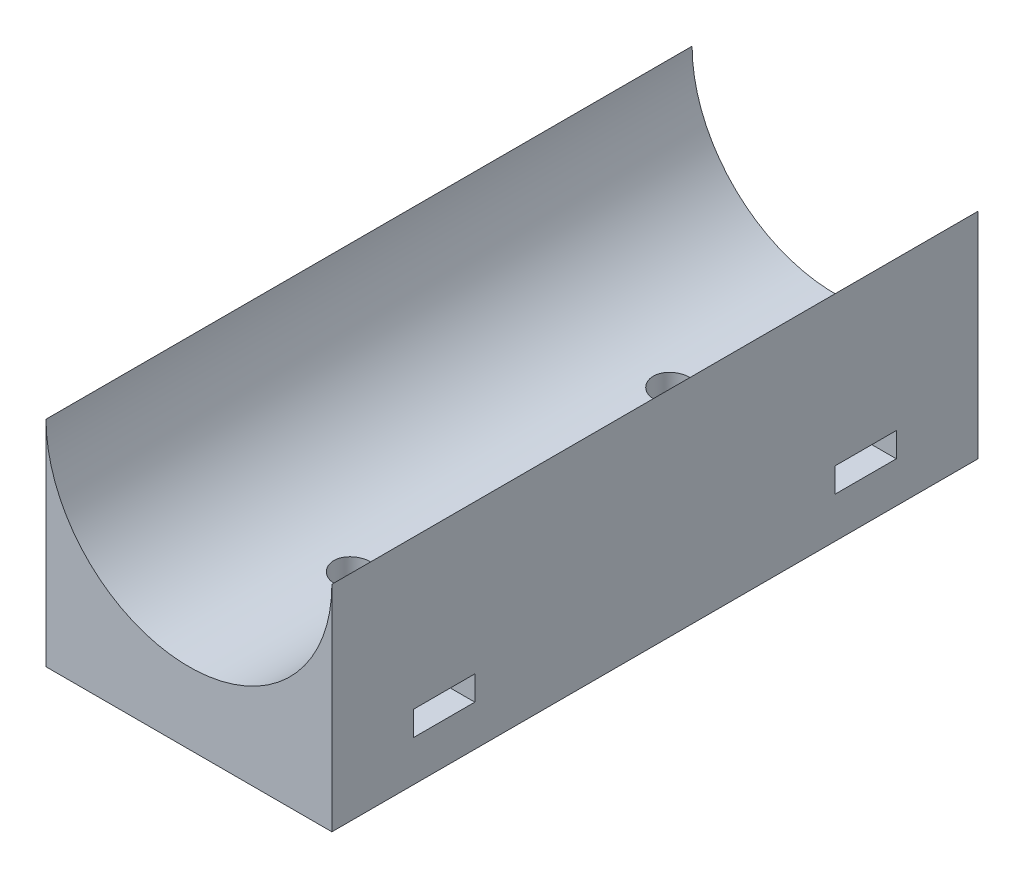
ISO-10303-21;
HEADER;
FILE_DESCRIPTION(('STEP AP214'),'2;1');
FILE_NAME('part.step','',(''),(''),'','','');
FILE_SCHEMA(('AUTOMOTIVE_DESIGN { 1 0 10303 214 1 1 1 1 }'));
ENDSEC;
DATA;
#1=APPLICATION_CONTEXT('core data for automotive mechanical design processes');
#2=APPLICATION_PROTOCOL_DEFINITION('international standard','automotive_design',2000,#1);
#3=PRODUCT_CONTEXT('',#1,'mechanical');
#4=PRODUCT('Part','Part','',(#3));
#5=PRODUCT_RELATED_PRODUCT_CATEGORY('part','',(#4));
#6=PRODUCT_DEFINITION_FORMATION('','',#4);
#7=PRODUCT_DEFINITION_CONTEXT('part definition',#1,'design');
#8=PRODUCT_DEFINITION('design','',#6,#7);
#9=PRODUCT_DEFINITION_SHAPE('','',#8);
#10=(LENGTH_UNIT() NAMED_UNIT(*) SI_UNIT(.MILLI.,.METRE.));
#11=(NAMED_UNIT(*) PLANE_ANGLE_UNIT() SI_UNIT($,.RADIAN.));
#12=(NAMED_UNIT(*) SI_UNIT($,.STERADIAN.) SOLID_ANGLE_UNIT());
#13=UNCERTAINTY_MEASURE_WITH_UNIT(LENGTH_MEASURE(1.E-05),#10,'distance_accuracy_value','');
#14=(GEOMETRIC_REPRESENTATION_CONTEXT(3) GLOBAL_UNCERTAINTY_ASSIGNED_CONTEXT((#13)) GLOBAL_UNIT_ASSIGNED_CONTEXT((#10,
#11,#12)) REPRESENTATION_CONTEXT('',''));
#15=CARTESIAN_POINT('',(0.,0.,0.));
#16=DIRECTION('',(0.,0.,1.));
#17=DIRECTION('',(1.,0.,0.));
#18=AXIS2_PLACEMENT_3D('',#15,#16,#17);
#19=CARTESIAN_POINT('',(0.,26.25,1687.65314094708));
#20=DIRECTION('',(1.,0.,0.));
#21=DIRECTION('',(0.,0.,-1.));
#22=AXIS2_PLACEMENT_3D('',#19,#20,#21);
#23=PLANE('',#22);
#24=DIRECTION('',(0.,0.,-1.));
#25=VECTOR('',#24,1.);
#26=CARTESIAN_POINT('',(0.,8.,1626.05314094708));
#27=LINE('',#26,#25);
#28=CARTESIAN_POINT('',(0.,8.,1626.05314094708));
#29=VERTEX_POINT('',#28);
#30=CARTESIAN_POINT('',(0.,8.,1618.55314094708));
#31=VERTEX_POINT('',#30);
#32=EDGE_CURVE('E239',#29,#31,#27,.T.);
#33=ORIENTED_EDGE('',*,*,#32,.F.);
#34=DIRECTION('',(0.,1.,0.));
#35=VECTOR('',#34,1.);
#36=CARTESIAN_POINT('',(0.,8.,1626.05314094708));
#37=LINE('',#36,#35);
#38=CARTESIAN_POINT('',(0.,5.,1626.05314094708));
#39=VERTEX_POINT('',#38);
#40=EDGE_CURVE('E152',#39,#29,#37,.T.);
#41=ORIENTED_EDGE('',*,*,#40,.F.);
#42=DIRECTION('',(0.,0.,1.));
#43=VECTOR('',#42,1.);
#44=CARTESIAN_POINT('',(0.,5.,1626.05314094708));
#45=LINE('',#44,#43);
#46=CARTESIAN_POINT('',(0.,5.,1618.55314094708));
#47=VERTEX_POINT('',#46);
#48=EDGE_CURVE('E149',#47,#39,#45,.T.);
#49=ORIENTED_EDGE('',*,*,#48,.F.);
#50=DIRECTION('',(0.,-1.,0.));
#51=VECTOR('',#50,1.);
#52=CARTESIAN_POINT('',(0.,8.,1618.55314094708));
#53=LINE('',#52,#51);
#54=EDGE_CURVE('E127',#31,#47,#53,.T.);
#55=ORIENTED_EDGE('',*,*,#54,.F.);
#56=EDGE_LOOP('',(#33,#41,#49,#55));
#57=FACE_BOUND('',#56,.T.);
#58=DIRECTION('',(0.,0.,-1.));
#59=VECTOR('',#58,1.);
#60=CARTESIAN_POINT('',(0.,8.,1677.65314094708));
#61=LINE('',#60,#59);
#62=CARTESIAN_POINT('',(0.,8.,1677.65314094708));
#63=VERTEX_POINT('',#62);
#64=CARTESIAN_POINT('',(0.,8.,1670.15314094708));
#65=VERTEX_POINT('',#64);
#66=EDGE_CURVE('E156',#63,#65,#61,.T.);
#67=ORIENTED_EDGE('',*,*,#66,.F.);
#68=DIRECTION('',(0.,1.,0.));
#69=VECTOR('',#68,1.);
#70=CARTESIAN_POINT('',(0.,8.,1677.65314094708));
#71=LINE('',#70,#69);
#72=CARTESIAN_POINT('',(0.,5.,1677.65314094708));
#73=VERTEX_POINT('',#72);
#74=EDGE_CURVE('E159',#73,#63,#71,.T.);
#75=ORIENTED_EDGE('',*,*,#74,.F.);
#76=DIRECTION('',(0.,0.,1.));
#77=VECTOR('',#76,1.);
#78=CARTESIAN_POINT('',(0.,5.,1677.65314094708));
#79=LINE('',#78,#77);
#80=CARTESIAN_POINT('',(0.,5.,1670.15314094708));
#81=VERTEX_POINT('',#80);
#82=EDGE_CURVE('E161',#81,#73,#79,.T.);
#83=ORIENTED_EDGE('',*,*,#82,.F.);
#84=DIRECTION('',(0.,-1.,0.));
#85=VECTOR('',#84,1.);
#86=CARTESIAN_POINT('',(0.,8.,1670.15314094708));
#87=LINE('',#86,#85);
#88=EDGE_CURVE('E153',#65,#81,#87,.T.);
#89=ORIENTED_EDGE('',*,*,#88,.F.);
#90=EDGE_LOOP('',(#67,#75,#83,#89));
#91=FACE_BOUND('',#90,.T.);
#92=DIRECTION('',(0.,-1.,0.));
#93=VECTOR('',#92,1.);
#94=CARTESIAN_POINT('',(0.,26.25,1608.55314094708));
#95=LINE('',#94,#93);
#96=CARTESIAN_POINT('',(0.,26.25,1608.55314094708));
#97=VERTEX_POINT('',#96);
#98=CARTESIAN_POINT('',(0.,0.,1608.55314094708));
#99=VERTEX_POINT('',#98);
#100=EDGE_CURVE('E248',#97,#99,#95,.T.);
#101=ORIENTED_EDGE('',*,*,#100,.T.);
#102=DIRECTION('',(0.,0.,-1.));
#103=VECTOR('',#102,1.);
#104=CARTESIAN_POINT('',(0.,0.,1687.65314094708));
#105=LINE('',#104,#103);
#106=CARTESIAN_POINT('',(0.,0.,1687.65314094708));
#107=VERTEX_POINT('',#106);
#108=EDGE_CURVE('E11',#107,#99,#105,.T.);
#109=ORIENTED_EDGE('',*,*,#108,.F.);
#110=DIRECTION('',(0.,-1.,0.));
#111=VECTOR('',#110,1.);
#112=CARTESIAN_POINT('',(0.,26.25,1687.65314094708));
#113=LINE('',#112,#111);
#114=CARTESIAN_POINT('',(0.,26.25,1687.65314094708));
#115=VERTEX_POINT('',#114);
#116=EDGE_CURVE('E267',#115,#107,#113,.T.);
#117=ORIENTED_EDGE('',*,*,#116,.F.);
#118=DIRECTION('',(0.,0.,-1.));
#119=VECTOR('',#118,1.);
#120=CARTESIAN_POINT('',(0.,26.25,1687.65314094708));
#121=LINE('',#120,#119);
#122=EDGE_CURVE('E251',#115,#97,#121,.T.);
#123=ORIENTED_EDGE('',*,*,#122,.T.);
#124=EDGE_LOOP('',(#101,#109,#117,#123));
#125=FACE_BOUND('',#124,.T.);
#126=ADVANCED_FACE('F33',(#57,#91,#125),#23,.F.);
#127=CARTESIAN_POINT('',(0.,0.,1687.65314094708));
#128=DIRECTION('',(0.,1.,0.));
#129=DIRECTION('',(0.,0.,1.));
#130=AXIS2_PLACEMENT_3D('',#127,#128,#129);
#131=PLANE('',#130);
#132=CARTESIAN_POINT('',(17.4999999967561,0.,1628.55314094708));
#133=DIRECTION('',(0.,1.,0.));
#134=DIRECTION('',(0.,0.,1.));
#135=AXIS2_PLACEMENT_3D('',#132,#133,#134);
#136=CIRCLE('',#135,2.25000000000009);
#137=CARTESIAN_POINT('',(17.4999999967561,0.,1630.80314094708));
#138=VERTEX_POINT('',#137);
#139=EDGE_CURVE('E181',#138,#138,#136,.T.);
#140=ORIENTED_EDGE('',*,*,#139,.T.);
#141=EDGE_LOOP('',(#140));
#142=FACE_BOUND('',#141,.T.);
#143=CARTESIAN_POINT('',(17.5,0.,1667.65314094708));
#144=DIRECTION('',(0.,1.,0.));
#145=DIRECTION('',(0.,0.,1.));
#146=AXIS2_PLACEMENT_3D('',#143,#144,#145);
#147=CIRCLE('',#146,2.24999999999999);
#148=CARTESIAN_POINT('',(17.5,0.,1669.90314094708));
#149=VERTEX_POINT('',#148);
#150=EDGE_CURVE('E191',#149,#149,#147,.T.);
#151=ORIENTED_EDGE('',*,*,#150,.T.);
#152=EDGE_LOOP('',(#151));
#153=FACE_BOUND('',#152,.T.);
#154=DIRECTION('',(1.,0.,0.));
#155=VECTOR('',#154,1.);
#156=CARTESIAN_POINT('',(0.,0.,1608.55314094708));
#157=LINE('',#156,#155);
#158=CARTESIAN_POINT('',(35.,0.,1608.55314094708));
#159=VERTEX_POINT('',#158);
#160=EDGE_CURVE('E254',#99,#159,#157,.T.);
#161=ORIENTED_EDGE('',*,*,#160,.T.);
#162=DIRECTION('',(0.,0.,-1.));
#163=VECTOR('',#162,1.);
#164=CARTESIAN_POINT('',(35.,0.,1687.65314094708));
#165=LINE('',#164,#163);
#166=CARTESIAN_POINT('',(35.,0.,1687.65314094708));
#167=VERTEX_POINT('',#166);
#168=EDGE_CURVE('E40',#167,#159,#165,.T.);
#169=ORIENTED_EDGE('',*,*,#168,.F.);
#170=DIRECTION('',(1.,0.,0.));
#171=VECTOR('',#170,1.);
#172=CARTESIAN_POINT('',(0.,0.,1687.65314094708));
#173=LINE('',#172,#171);
#174=EDGE_CURVE('E285',#107,#167,#173,.T.);
#175=ORIENTED_EDGE('',*,*,#174,.F.);
#176=ORIENTED_EDGE('',*,*,#108,.T.);
#177=EDGE_LOOP('',(#161,#169,#175,#176));
#178=FACE_BOUND('',#177,.T.);
#179=ADVANCED_FACE('F230',(#142,#153,#178),#131,.F.);
#180=CARTESIAN_POINT('',(35.,26.25,1687.65314094708));
#181=DIRECTION('',(-1.,0.,0.));
#182=DIRECTION('',(0.,0.,1.));
#183=AXIS2_PLACEMENT_3D('',#180,#181,#182);
#184=PLANE('',#183);
#185=DIRECTION('',(0.,0.,-1.));
#186=VECTOR('',#185,1.);
#187=CARTESIAN_POINT('',(35.,5.,1626.05314094708));
#188=LINE('',#187,#186);
#189=CARTESIAN_POINT('',(35.,5.,1626.05314094708));
#190=VERTEX_POINT('',#189);
#191=CARTESIAN_POINT('',(35.,5.,1618.55314094708));
#192=VERTEX_POINT('',#191);
#193=EDGE_CURVE('E133',#190,#192,#188,.T.);
#194=ORIENTED_EDGE('',*,*,#193,.F.);
#195=DIRECTION('',(0.,-1.,0.));
#196=VECTOR('',#195,1.);
#197=CARTESIAN_POINT('',(35.,8.,1626.05314094708));
#198=LINE('',#197,#196);
#199=CARTESIAN_POINT('',(35.,8.,1626.05314094708));
#200=VERTEX_POINT('',#199);
#201=EDGE_CURVE('E55',#200,#190,#198,.T.);
#202=ORIENTED_EDGE('',*,*,#201,.F.);
#203=DIRECTION('',(0.,0.,1.));
#204=VECTOR('',#203,1.);
#205=CARTESIAN_POINT('',(35.,8.,1626.05314094708));
#206=LINE('',#205,#204);
#207=CARTESIAN_POINT('',(35.,8.,1618.55314094708));
#208=VERTEX_POINT('',#207);
#209=EDGE_CURVE('E140',#208,#200,#206,.T.);
#210=ORIENTED_EDGE('',*,*,#209,.F.);
#211=DIRECTION('',(0.,1.,0.));
#212=VECTOR('',#211,1.);
#213=CARTESIAN_POINT('',(35.,8.,1618.55314094708));
#214=LINE('',#213,#212);
#215=EDGE_CURVE('E124',#192,#208,#214,.T.);
#216=ORIENTED_EDGE('',*,*,#215,.F.);
#217=EDGE_LOOP('',(#194,#202,#210,#216));
#218=FACE_BOUND('',#217,.T.);
#219=DIRECTION('',(0.,0.,-1.));
#220=VECTOR('',#219,1.);
#221=CARTESIAN_POINT('',(35.,5.,1677.65314094708));
#222=LINE('',#221,#220);
#223=CARTESIAN_POINT('',(35.,5.,1677.65314094708));
#224=VERTEX_POINT('',#223);
#225=CARTESIAN_POINT('',(35.,5.,1670.15314094708));
#226=VERTEX_POINT('',#225);
#227=EDGE_CURVE('E163',#224,#226,#222,.T.);
#228=ORIENTED_EDGE('',*,*,#227,.F.);
#229=DIRECTION('',(0.,-1.,0.));
#230=VECTOR('',#229,1.);
#231=CARTESIAN_POINT('',(35.,8.,1677.65314094708));
#232=LINE('',#231,#230);
#233=CARTESIAN_POINT('',(35.,8.,1677.65314094708));
#234=VERTEX_POINT('',#233);
#235=EDGE_CURVE('E151',#234,#224,#232,.T.);
#236=ORIENTED_EDGE('',*,*,#235,.F.);
#237=DIRECTION('',(0.,0.,1.));
#238=VECTOR('',#237,1.);
#239=CARTESIAN_POINT('',(35.,8.,1677.65314094708));
#240=LINE('',#239,#238);
#241=CARTESIAN_POINT('',(35.,8.,1670.15314094708));
#242=VERTEX_POINT('',#241);
#243=EDGE_CURVE('E169',#242,#234,#240,.T.);
#244=ORIENTED_EDGE('',*,*,#243,.F.);
#245=DIRECTION('',(0.,1.,0.));
#246=VECTOR('',#245,1.);
#247=CARTESIAN_POINT('',(35.,8.,1670.15314094708));
#248=LINE('',#247,#246);
#249=EDGE_CURVE('E166',#226,#242,#248,.T.);
#250=ORIENTED_EDGE('',*,*,#249,.F.);
#251=EDGE_LOOP('',(#228,#236,#244,#250));
#252=FACE_BOUND('',#251,.T.);
#253=DIRECTION('',(0.,1.,0.));
#254=VECTOR('',#253,1.);
#255=CARTESIAN_POINT('',(35.,26.25,1608.55314094708));
#256=LINE('',#255,#254);
#257=CARTESIAN_POINT('',(35.,26.25,1608.55314094708));
#258=VERTEX_POINT('',#257);
#259=EDGE_CURVE('E257',#159,#258,#256,.T.);
#260=ORIENTED_EDGE('',*,*,#259,.T.);
#261=DIRECTION('',(0.,0.,-1.));
#262=VECTOR('',#261,1.);
#263=CARTESIAN_POINT('',(35.,26.25,1687.65314094708));
#264=LINE('',#263,#262);
#265=CARTESIAN_POINT('',(35.,26.25,1687.65314094708));
#266=VERTEX_POINT('',#265);
#267=EDGE_CURVE('E269',#266,#258,#264,.T.);
#268=ORIENTED_EDGE('',*,*,#267,.F.);
#269=DIRECTION('',(0.,1.,0.));
#270=VECTOR('',#269,1.);
#271=CARTESIAN_POINT('',(35.,26.25,1687.65314094708));
#272=LINE('',#271,#270);
#273=EDGE_CURVE('E277',#167,#266,#272,.T.);
#274=ORIENTED_EDGE('',*,*,#273,.F.);
#275=ORIENTED_EDGE('',*,*,#168,.T.);
#276=EDGE_LOOP('',(#260,#268,#274,#275));
#277=FACE_BOUND('',#276,.T.);
#278=ADVANCED_FACE('F137',(#218,#252,#277),#184,.F.);
#279=CARTESIAN_POINT('',(17.5,26.25,1687.65314094708));
#280=DIRECTION('',(0.,0.,-1.));
#281=DIRECTION('',(-1.,0.,0.));
#282=AXIS2_PLACEMENT_3D('',#279,#280,#281);
#283=CYLINDRICAL_SURFACE('',#282,17.5);
#284=CARTESIAN_POINT('',(17.4999999978374,8.75,1626.30314094708));
#285=CARTESIAN_POINT('',(17.6258266617738,8.75000179600986,1626.30314627395));
#286=CARTESIAN_POINT('',(17.7517312142782,8.75137137614066,1626.31373144051));
#287=CARTESIAN_POINT('',(18.0000347508825,8.75670315495112,1626.35578947551));
#288=CARTESIAN_POINT('',(18.1224299702854,8.76066803659769,1626.38728396003));
#289=CARTESIAN_POINT('',(18.3600843557582,8.77074389818164,1626.47021560561));
#290=CARTESIAN_POINT('',(18.4753483411962,8.77685340970022,1626.52163912385));
#291=CARTESIAN_POINT('',(18.69558917955,8.79053961235518,1626.64293879086));
#292=CARTESIAN_POINT('',(18.8005677484096,8.79811605812911,1626.71281185443));
#293=CARTESIAN_POINT('',(18.9978891192236,8.8139398982389,1626.86946102291));
#294=CARTESIAN_POINT('',(19.090163533246,8.82219056988019,1626.95632294961));
#295=CARTESIAN_POINT('',(19.2588681393375,8.83840663855668,1627.14429981096));
#296=CARTESIAN_POINT('',(19.3352975108857,8.84637202080078,1627.24541548328));
#297=CARTESIAN_POINT('',(19.4703988189745,8.86114782000338,1627.4594760623));
#298=CARTESIAN_POINT('',(19.5290063920937,8.8679540125294,1627.5724619078));
#299=CARTESIAN_POINT('',(19.6263893739097,8.879597353629,1627.80677453463));
#300=CARTESIAN_POINT('',(19.6651655774482,8.88443458111715,1627.92810098144));
#301=CARTESIAN_POINT('',(19.7215766511488,8.89156086077708,1628.17493962781));
#302=CARTESIAN_POINT('',(19.7393272305207,8.89386385443797,1628.30042497429));
#303=CARTESIAN_POINT('',(19.7535412807915,8.8957035268884,1628.55261296313));
#304=CARTESIAN_POINT('',(19.75000565572,8.89524032315895,1628.67931555357));
#305=CARTESIAN_POINT('',(19.7218425871825,8.89161269513579,1628.92953357084));
#306=CARTESIAN_POINT('',(19.6973427872308,8.88846461847485,1629.05306363522));
#307=CARTESIAN_POINT('',(19.6281460700384,8.87984745579833,1629.29424449096));
#308=CARTESIAN_POINT('',(19.5834487219485,8.87437832027065,1629.41189515684));
#309=CARTESIAN_POINT('',(19.4749890941291,8.86171680081241,1629.63837300161));
#310=CARTESIAN_POINT('',(19.4111715317994,8.85451943215859,1629.74717341576));
#311=CARTESIAN_POINT('',(19.2663225454983,8.83921622760884,1629.95256896199));
#312=CARTESIAN_POINT('',(19.1852902887966,8.83111034777425,1630.04916350327));
#313=CARTESIAN_POINT('',(19.0076056072231,8.81483083628081,1630.22814607941));
#314=CARTESIAN_POINT('',(18.9108431963408,8.80665714296976,1630.31042495957));
#315=CARTESIAN_POINT('',(18.7048231228902,8.79121842723455,1630.4575900876));
#316=CARTESIAN_POINT('',(18.5955654285917,8.78395340711794,1630.52247629131));
#317=CARTESIAN_POINT('',(18.3675706586007,8.77114572460755,1630.63301499328));
#318=CARTESIAN_POINT('',(18.2488301301963,8.76560369318281,1630.67866044764));
#319=CARTESIAN_POINT('',(18.0052826254796,8.75687207768555,1630.74933420714));
#320=CARTESIAN_POINT('',(17.8804759500655,8.75368237705742,1630.7743635338));
#321=CARTESIAN_POINT('',(17.6292825295654,8.75003000383695,1630.80295258997));
#322=CARTESIAN_POINT('',(17.5029131602783,8.74954823765919,1630.80666264534));
#323=CARTESIAN_POINT('',(17.2513544216895,8.75131440756062,1630.79290485969));
#324=CARTESIAN_POINT('',(17.1261650258315,8.75356228205827,1630.77543749645));
#325=CARTESIAN_POINT('',(16.8809650206226,8.76052327557305,1630.71994560954));
#326=CARTESIAN_POINT('',(16.7609378774166,8.76522777231829,1630.68199296967));
#327=CARTESIAN_POINT('',(16.5289516807731,8.77657544522559,1630.58668274195));
#328=CARTESIAN_POINT('',(16.4169929158314,8.78321869066739,1630.52932446064));
#329=CARTESIAN_POINT('',(16.2036515701694,8.79775114171666,1630.39646889763));
#330=CARTESIAN_POINT('',(16.1023298463052,8.80564692966052,1630.32087462364));
#331=CARTESIAN_POINT('',(15.9137583963126,8.82178117445856,1630.15382984644));
#332=CARTESIAN_POINT('',(15.8265092627168,8.83001964572321,1630.06237867592));
#333=CARTESIAN_POINT('',(15.6680245111409,8.84596985885961,1629.86555293616));
#334=CARTESIAN_POINT('',(15.5968886930534,8.85367812257582,1629.76009768455));
#335=CARTESIAN_POINT('',(15.4733398726244,8.86763736390481,1629.53864778007));
#336=CARTESIAN_POINT('',(15.4209264767642,8.87388837214607,1629.4226533488));
#337=CARTESIAN_POINT('',(15.3364709935068,8.88420143687275,1629.18373652056));
#338=CARTESIAN_POINT('',(15.3043731351808,8.88826948138774,1629.0608341078));
#339=CARTESIAN_POINT('',(15.2612805208833,8.89377302490021,1628.81132802519));
#340=CARTESIAN_POINT('',(15.2502847215265,8.89520865405654,1628.68472453865));
#341=CARTESIAN_POINT('',(15.2497282501389,8.89528088028547,1628.43240321227));
#342=CARTESIAN_POINT('',(15.2600107761963,8.89393795280608,1628.30668569539));
#343=CARTESIAN_POINT('',(15.3013865029429,8.8886484638993,1628.05878183304));
#344=CARTESIAN_POINT('',(15.3324797017695,8.88470190270494,1627.93659548726));
#345=CARTESIAN_POINT('',(15.4145442530073,8.87465626716688,1627.69924606574));
#346=CARTESIAN_POINT('',(15.4655075956655,8.8685580602562,1627.58408018163));
#347=CARTESIAN_POINT('',(15.585850357649,8.85489487121359,1627.36390932706));
#348=CARTESIAN_POINT('',(15.6552300604445,8.84732986650473,1627.25890451303));
#349=CARTESIAN_POINT('',(15.811016352984,8.83151872158675,1627.06123553117));
#350=CARTESIAN_POINT('',(15.897539732207,8.82326814827556,1626.96866375466));
#351=CARTESIAN_POINT('',(16.0849129178364,8.80705436566009,1626.79929400653));
#352=CARTESIAN_POINT('',(16.1857660899385,8.79909122441871,1626.72249975101));
#353=CARTESIAN_POINT('',(16.3994029264507,8.78431398982926,1626.58660007733));
#354=CARTESIAN_POINT('',(16.5122329074654,8.77750464279797,1626.52756698602));
#355=CARTESIAN_POINT('',(16.7462308864178,8.76585004092236,1626.42937138013));
#356=CARTESIAN_POINT('',(16.8673897184376,8.76100266615589,1626.39018740688));
#357=CARTESIAN_POINT('',(17.0743040698097,8.75497856708628,1626.34211758211));
#358=CARTESIAN_POINT('',(17.1587581371535,8.75312076424168,1626.32752252307));
#359=CARTESIAN_POINT('',(17.3287961201553,8.75063087452587,1626.30803243185));
#360=CARTESIAN_POINT('',(17.4143800268048,8.74999877788771,1626.30313732236));
#361=CARTESIAN_POINT('',(17.4999999978374,8.75,1626.30314094708));
#362=B_SPLINE_CURVE_WITH_KNOTS('',3,(#284,#285,#286,#287,#288,#289,#290,#291,#292,#293,#294,
#295,#296,#297,#298,#299,#300,#301,#302,#303,#304,#305,#306,#307,#308,#309,#310,#311,#312,#313,
#314,#315,#316,#317,#318,#319,#320,#321,#322,#323,#324,#325,#326,#327,#328,#329,#330,#331,#332,
#333,#334,#335,#336,#337,#338,#339,#340,#341,#342,#343,#344,#345,#346,#347,#348,#349,#350,#351,
#352,#353,#354,#355,#356,#357,#358,#359,#360,#361),.UNSPECIFIED.,.T.,.F.,(4,2,2,2,2,2,2,2,2,2,2,
2,2,2,2,2,2,2,2,2,2,2,2,2,2,2,2,2,2,2,2,2,2,2,2,2,2,2,4),(0.,0.377167233438984,
0.754724991353809,1.13202473972151,1.50926143458833,1.88845545438442,2.26766910549001,
2.64823645182459,3.02878854381839,3.40723648686324,3.78566835725645,4.16181235141852,
4.53796436977002,4.9152146341355,5.29248315147274,5.67251296808488,6.05254374975563,
6.43271353754754,6.81286448704381,7.19033160575384,7.56779020884587,7.94393282192979,
8.32008887783615,8.69829151453878,9.07651007147589,9.45701074759529,9.83750342565795,
10.2169469787708,10.5963717699233,10.9730105043803,11.3496492051294,11.7261362376714,
12.1026290655546,12.4817808194568,12.8610217739108,13.2417867945203,13.6221392909519,
13.8787884296895,14.135435523328),.UNSPECIFIED.);
#363=CARTESIAN_POINT('',(17.4999999978374,8.75,1626.30314094708));
#364=VERTEX_POINT('',#363);
#365=EDGE_CURVE('E184',#364,#364,#362,.T.);
#366=ORIENTED_EDGE('',*,*,#365,.T.);
#367=EDGE_LOOP('',(#366));
#368=FACE_BOUND('',#367,.T.);
#369=CARTESIAN_POINT('',(17.5,8.75,1669.90314094708));
#370=CARTESIAN_POINT('',(17.3741733360636,8.7500017960254,1669.90313562021));
#371=CARTESIAN_POINT('',(17.2482687835594,8.75137137617176,1669.89255045365));
#372=CARTESIAN_POINT('',(16.9999652469558,8.75670315501291,1669.85049241865));
#373=CARTESIAN_POINT('',(16.8775700275533,8.76066803667461,1669.81899793412));
#374=CARTESIAN_POINT('',(16.6399156420818,8.77074389828793,1669.73606628854));
#375=CARTESIAN_POINT('',(16.5246516566445,8.77685340982075,1669.6846427703));
#376=CARTESIAN_POINT('',(16.3044108182924,8.79053961250292,1669.56334310329));
#377=CARTESIAN_POINT('',(16.1994322494338,8.79811605828983,1669.49347003972));
#378=CARTESIAN_POINT('',(16.0021108786218,8.813939898424,1669.33682087125));
#379=CARTESIAN_POINT('',(15.9098364646004,8.82219057007669,1669.24995894455));
#380=CARTESIAN_POINT('',(15.741131858511,8.83840663877403,1669.06198208319));
#381=CARTESIAN_POINT('',(15.6647024869638,8.84637202102756,1668.96086641088));
#382=CARTESIAN_POINT('',(15.5296011788768,8.86114782024685,1668.74680583186));
#383=CARTESIAN_POINT('',(15.4709936057584,8.86795401278012,1668.63381998635));
#384=CARTESIAN_POINT('',(15.3736106239438,8.87959735389176,1668.39950735953));
#385=CARTESIAN_POINT('',(15.3348344204059,8.8844345813847,1668.27818091271));
#386=CARTESIAN_POINT('',(15.2784233467062,8.8915608610516,1668.03134226635));
#387=CARTESIAN_POINT('',(15.2606727673346,8.89386385471468,1667.90585691987));
#388=CARTESIAN_POINT('',(15.246458717064,8.89570352716687,1667.65366893103));
#389=CARTESIAN_POINT('',(15.2499943421354,8.89524032343698,1667.52696634059));
#390=CARTESIAN_POINT('',(15.2781574106725,8.89161269541034,1667.27674832332));
#391=CARTESIAN_POINT('',(15.3026572106238,8.88846461874638,1667.15321825894));
#392=CARTESIAN_POINT('',(15.3718539278152,8.87984745606131,1666.9120374032));
#393=CARTESIAN_POINT('',(15.4165512759044,8.8743783205281,1666.79438673731));
#394=CARTESIAN_POINT('',(15.5250109037223,8.86171680105646,1666.56790889254));
#395=CARTESIAN_POINT('',(15.5888284660511,8.85451943239475,1666.45910847839));
#396=CARTESIAN_POINT('',(15.7336774523502,8.83921622782711,1666.25371293217));
#397=CARTESIAN_POINT('',(15.814709709051,8.8311103479825,1666.15711839089));
#398=CARTESIAN_POINT('',(15.9923943906225,8.8148308364671,1665.97813581474));
#399=CARTESIAN_POINT('',(16.0891568015038,8.8066571431441,1665.89585693459));
#400=CARTESIAN_POINT('',(16.2951768749524,8.79121842738343,1665.74869180656));
#401=CARTESIAN_POINT('',(16.4044345692501,8.78395340725332,1665.68380560285));
#402=CARTESIAN_POINT('',(16.6324293392395,8.77114572471476,1665.57326690087));
#403=CARTESIAN_POINT('',(16.7511698676433,8.76560369327534,1665.52762144651));
#404=CARTESIAN_POINT('',(16.9947173723588,8.75687207774799,1665.45694768701));
#405=CARTESIAN_POINT('',(17.1195240477724,8.75368237710444,1665.43191836035));
#406=CARTESIAN_POINT('',(17.370717468272,8.75003000385293,1665.40332930419));
#407=CARTESIAN_POINT('',(17.497086837559,8.74954823765954,1665.39961924882));
#408=CARTESIAN_POINT('',(17.7486455761481,8.75131440752989,1665.41337703446));
#409=CARTESIAN_POINT('',(17.8738349720064,8.75356228201208,1665.43084439771));
#410=CARTESIAN_POINT('',(18.1190349772161,8.76052327549655,1665.48633628462));
#411=CARTESIAN_POINT('',(18.2390621204227,8.76522777222696,1665.52428892448));
#412=CARTESIAN_POINT('',(18.4710483170676,8.77657544510559,1665.6195991522));
#413=CARTESIAN_POINT('',(18.58300708201,8.78321869053355,1665.67695743352));
#414=CARTESIAN_POINT('',(18.7963484276738,8.79775114155647,1665.80981299652));
#415=CARTESIAN_POINT('',(18.8976701515391,8.80564692948781,1665.88540727052));
#416=CARTESIAN_POINT('',(19.0862416015337,8.82178117426254,1666.05245204771));
#417=CARTESIAN_POINT('',(19.1734907351305,8.8300196455164,1666.14390321823));
#418=CARTESIAN_POINT('',(19.3319754867083,8.84596985863321,1666.34072895799));
#419=CARTESIAN_POINT('',(19.4031113047967,8.85367812234063,1666.44618420961));
#420=CARTESIAN_POINT('',(19.5266601252274,8.86763736365434,1666.66763411408));
#421=CARTESIAN_POINT('',(19.5790735210885,8.87388837188913,1666.78362854536));
#422=CARTESIAN_POINT('',(19.6635290043471,8.88420143660537,1667.0225453736));
#423=CARTESIAN_POINT('',(19.6956268626736,8.8882694811164,1667.14544778635));
#424=CARTESIAN_POINT('',(19.7387194769718,8.89377302462354,1667.39495386896));
#425=CARTESIAN_POINT('',(19.7497152763287,8.89520865377852,1667.5215573555));
#426=CARTESIAN_POINT('',(19.7502717477164,8.89528088000738,1667.77387868188));
#427=CARTESIAN_POINT('',(19.7399892216588,8.89393795252925,1667.89959619876));
#428=CARTESIAN_POINT('',(19.6986134949116,8.88864846362759,1668.14750006111));
#429=CARTESIAN_POINT('',(19.6675202960845,8.88470190243708,1668.2696864069));
#430=CARTESIAN_POINT('',(19.5854557448455,8.87465626690916,1668.50703582841));
#431=CARTESIAN_POINT('',(19.5344924021865,8.86855806000478,1668.62220171252));
#432=CARTESIAN_POINT('',(19.4141496402014,8.85489487097704,1668.84237256709));
#433=CARTESIAN_POINT('',(19.3447699374049,8.84732986627676,1668.94737738112));
#434=CARTESIAN_POINT('',(19.1889836448634,8.83151872137802,1669.14504636299));
#435=CARTESIAN_POINT('',(19.1024602656394,8.82326814807753,1669.23761813949));
#436=CARTESIAN_POINT('',(18.915087080008,8.80705436548521,1669.40698788763));
#437=CARTESIAN_POINT('',(18.8142339079049,8.79909122425629,1669.48378214314));
#438=CARTESIAN_POINT('',(18.6005970713908,8.78431398969324,1669.61968181682));
#439=CARTESIAN_POINT('',(18.4877670903753,8.77750464267591,1669.67871490813));
#440=CARTESIAN_POINT('',(18.2537691114215,8.76585004082921,1669.77691051402));
#441=CARTESIAN_POINT('',(18.1326102794011,8.76100266607771,1669.81609448728));
#442=CARTESIAN_POINT('',(17.9256959280283,8.75497856703367,1669.86416431205));
#443=CARTESIAN_POINT('',(17.8412418606843,8.75312076419951,1669.87875937108));
#444=CARTESIAN_POINT('',(17.6712038776822,8.75063087450472,1669.89824946231));
#445=CARTESIAN_POINT('',(17.5856199710326,8.74999877787713,1669.9031445718));
#446=CARTESIAN_POINT('',(17.5,8.75,1669.90314094708));
#447=B_SPLINE_CURVE_WITH_KNOTS('',3,(#369,#370,#371,#372,#373,#374,#375,#376,#377,#378,#379,
#380,#381,#382,#383,#384,#385,#386,#387,#388,#389,#390,#391,#392,#393,#394,#395,#396,#397,#398,
#399,#400,#401,#402,#403,#404,#405,#406,#407,#408,#409,#410,#411,#412,#413,#414,#415,#416,#417,
#418,#419,#420,#421,#422,#423,#424,#425,#426,#427,#428,#429,#430,#431,#432,#433,#434,#435,#436,
#437,#438,#439,#440,#441,#442,#443,#444,#445,#446),.UNSPECIFIED.,.T.,.F.,(4,2,2,2,2,2,2,2,2,2,2,
2,2,2,2,2,2,2,2,2,2,2,2,2,2,2,2,2,2,2,2,2,2,2,2,2,2,2,4),(0.,0.377167233438959,0.7547249913538,
1.13202473972162,1.50926143458827,1.88845545438431,2.2676691054899,2.64823645182448,
3.02878854381828,3.40723648686313,3.78566835725634,4.16181235141841,4.53796436976991,
4.91521463413539,5.29248315147265,5.67251296808481,6.05254374975557,6.43271353754746,
6.81286448704356,7.1903316057536,7.56779020884569,7.94393282192945,8.32008887783591,
8.69829151453846,9.07651007147551,9.45701074759491,9.83750342565757,10.2169469787704,
10.5963717699229,10.9730105043801,11.349649205129,11.7261362376705,12.1026290655542,
12.4817808194563,12.8610217739105,13.2417867945198,13.6221392909513,13.878788429689,
14.1354355233275),.UNSPECIFIED.);
#448=CARTESIAN_POINT('',(17.5,8.75,1669.90314094708));
#449=VERTEX_POINT('',#448);
#450=EDGE_CURVE('E255',#449,#449,#447,.T.);
#451=ORIENTED_EDGE('',*,*,#450,.T.);
#452=EDGE_LOOP('',(#451));
#453=FACE_BOUND('',#452,.T.);
#454=CARTESIAN_POINT('',(17.5,26.25,1608.55314094708));
#455=DIRECTION('',(0.,0.,-1.));
#456=DIRECTION('',(1.,0.,0.));
#457=AXIS2_PLACEMENT_3D('',#454,#455,#456);
#458=CIRCLE('',#457,17.5);
#459=EDGE_CURVE('E265',#258,#97,#458,.T.);
#460=ORIENTED_EDGE('',*,*,#459,.T.);
#461=ORIENTED_EDGE('',*,*,#122,.F.);
#462=CARTESIAN_POINT('',(17.5,26.25,1687.65314094708));
#463=DIRECTION('',(0.,0.,-1.));
#464=DIRECTION('',(1.,0.,0.));
#465=AXIS2_PLACEMENT_3D('',#462,#463,#464);
#466=CIRCLE('',#465,17.5);
#467=EDGE_CURVE('E261',#266,#115,#466,.T.);
#468=ORIENTED_EDGE('',*,*,#467,.F.);
#469=ORIENTED_EDGE('',*,*,#267,.T.);
#470=EDGE_LOOP('',(#460,#461,#468,#469));
#471=FACE_BOUND('',#470,.T.);
#472=ADVANCED_FACE('F281',(#368,#453,#471),#283,.F.);
#473=CARTESIAN_POINT('',(17.5,26.25,1687.65314094708));
#474=DIRECTION('',(0.,0.,1.));
#475=DIRECTION('',(1.,0.,0.));
#476=AXIS2_PLACEMENT_3D('',#473,#474,#475);
#477=PLANE('',#476);
#478=ORIENTED_EDGE('',*,*,#116,.T.);
#479=ORIENTED_EDGE('',*,*,#174,.T.);
#480=ORIENTED_EDGE('',*,*,#273,.T.);
#481=ORIENTED_EDGE('',*,*,#467,.T.);
#482=EDGE_LOOP('',(#478,#479,#480,#481));
#483=FACE_BOUND('',#482,.T.);
#484=ADVANCED_FACE('F299',(#483),#477,.T.);
#485=CARTESIAN_POINT('',(17.5,26.25,1608.55314094708));
#486=DIRECTION('',(0.,0.,1.));
#487=DIRECTION('',(1.,0.,0.));
#488=AXIS2_PLACEMENT_3D('',#485,#486,#487);
#489=PLANE('',#488);
#490=ORIENTED_EDGE('',*,*,#100,.F.);
#491=ORIENTED_EDGE('',*,*,#459,.F.);
#492=ORIENTED_EDGE('',*,*,#259,.F.);
#493=ORIENTED_EDGE('',*,*,#160,.F.);
#494=EDGE_LOOP('',(#490,#491,#492,#493));
#495=FACE_BOUND('',#494,.T.);
#496=ADVANCED_FACE('F279',(#495),#489,.F.);
#497=CARTESIAN_POINT('',(17.5,8.75000000000001,1667.65314094708));
#498=DIRECTION('',(0.,1.,0.));
#499=DIRECTION('',(0.,0.,1.));
#500=AXIS2_PLACEMENT_3D('',#497,#498,#499);
#501=CYLINDRICAL_SURFACE('',#500,2.24999999999999);
#502=ORIENTED_EDGE('',*,*,#450,.F.);
#503=EDGE_LOOP('',(#502));
#504=FACE_BOUND('',#503,.T.);
#505=ORIENTED_EDGE('',*,*,#150,.F.);
#506=EDGE_LOOP('',(#505));
#507=FACE_BOUND('',#506,.T.);
#508=ADVANCED_FACE('F200',(#504,#507),#501,.F.);
#509=CARTESIAN_POINT('',(17.4999999978374,8.75,1628.55314094708));
#510=DIRECTION('',(1.2357555455113E-10,1.,0.));
#511=DIRECTION('',(-1.,1.2357555455113E-10,0.));
#512=AXIS2_PLACEMENT_3D('',#509,#510,#511);
#513=CYLINDRICAL_SURFACE('',#512,2.25000000000009);
#514=ORIENTED_EDGE('',*,*,#365,.F.);
#515=EDGE_LOOP('',(#514));
#516=FACE_BOUND('',#515,.T.);
#517=ORIENTED_EDGE('',*,*,#139,.F.);
#518=EDGE_LOOP('',(#517));
#519=FACE_BOUND('',#518,.T.);
#520=ADVANCED_FACE('F195',(#516,#519),#513,.F.);
#521=CARTESIAN_POINT('',(-8.07774721070181,8.,1677.65314094708));
#522=DIRECTION('',(0.,0.,1.));
#523=DIRECTION('',(1.,0.,0.));
#524=AXIS2_PLACEMENT_3D('',#521,#522,#523);
#525=PLANE('',#524);
#526=ORIENTED_EDGE('',*,*,#74,.T.);
#527=DIRECTION('',(1.,0.,0.));
#528=VECTOR('',#527,1.);
#529=CARTESIAN_POINT('',(-8.07774721070181,8.,1677.65314094708));
#530=LINE('',#529,#528);
#531=EDGE_CURVE('E157',#63,#234,#530,.T.);
#532=ORIENTED_EDGE('',*,*,#531,.T.);
#533=ORIENTED_EDGE('',*,*,#235,.T.);
#534=DIRECTION('',(1.,0.,0.));
#535=VECTOR('',#534,1.);
#536=CARTESIAN_POINT('',(-8.07774721070181,5.,1677.65314094708));
#537=LINE('',#536,#535);
#538=EDGE_CURVE('E172',#73,#224,#537,.T.);
#539=ORIENTED_EDGE('',*,*,#538,.F.);
#540=EDGE_LOOP('',(#526,#532,#533,#539));
#541=FACE_BOUND('',#540,.T.);
#542=ADVANCED_FACE('F199',(#541),#525,.F.);
#543=CARTESIAN_POINT('',(-8.07774721070181,8.,1677.65314094708));
#544=DIRECTION('',(0.,1.,0.));
#545=DIRECTION('',(0.,0.,1.));
#546=AXIS2_PLACEMENT_3D('',#543,#544,#545);
#547=PLANE('',#546);
#548=ORIENTED_EDGE('',*,*,#66,.T.);
#549=DIRECTION('',(1.,0.,0.));
#550=VECTOR('',#549,1.);
#551=CARTESIAN_POINT('',(-8.07774721070181,8.,1670.15314094708));
#552=LINE('',#551,#550);
#553=EDGE_CURVE('E174',#65,#242,#552,.T.);
#554=ORIENTED_EDGE('',*,*,#553,.T.);
#555=ORIENTED_EDGE('',*,*,#243,.T.);
#556=ORIENTED_EDGE('',*,*,#531,.F.);
#557=EDGE_LOOP('',(#548,#554,#555,#556));
#558=FACE_BOUND('',#557,.T.);
#559=ADVANCED_FACE('F204',(#558),#547,.F.);
#560=CARTESIAN_POINT('',(-8.07774721070181,8.,1670.15314094708));
#561=DIRECTION('',(0.,0.,-1.));
#562=DIRECTION('',(-1.,0.,0.));
#563=AXIS2_PLACEMENT_3D('',#560,#561,#562);
#564=PLANE('',#563);
#565=ORIENTED_EDGE('',*,*,#88,.T.);
#566=DIRECTION('',(1.,0.,0.));
#567=VECTOR('',#566,1.);
#568=CARTESIAN_POINT('',(-8.07774721070181,5.,1670.15314094708));
#569=LINE('',#568,#567);
#570=EDGE_CURVE('E176',#81,#226,#569,.T.);
#571=ORIENTED_EDGE('',*,*,#570,.T.);
#572=ORIENTED_EDGE('',*,*,#249,.T.);
#573=ORIENTED_EDGE('',*,*,#553,.F.);
#574=EDGE_LOOP('',(#565,#571,#572,#573));
#575=FACE_BOUND('',#574,.T.);
#576=ADVANCED_FACE('F210',(#575),#564,.F.);
#577=CARTESIAN_POINT('',(-8.07774721070181,5.,1677.65314094708));
#578=DIRECTION('',(0.,-1.,0.));
#579=DIRECTION('',(0.,0.,-1.));
#580=AXIS2_PLACEMENT_3D('',#577,#578,#579);
#581=PLANE('',#580);
#582=ORIENTED_EDGE('',*,*,#82,.T.);
#583=ORIENTED_EDGE('',*,*,#538,.T.);
#584=ORIENTED_EDGE('',*,*,#227,.T.);
#585=ORIENTED_EDGE('',*,*,#570,.F.);
#586=EDGE_LOOP('',(#582,#583,#584,#585));
#587=FACE_BOUND('',#586,.T.);
#588=ADVANCED_FACE('F206',(#587),#581,.F.);
#589=CARTESIAN_POINT('',(-8.07774721070181,8.,1626.05314094708));
#590=DIRECTION('',(0.,0.,1.));
#591=DIRECTION('',(1.,0.,0.));
#592=AXIS2_PLACEMENT_3D('',#589,#590,#591);
#593=PLANE('',#592);
#594=ORIENTED_EDGE('',*,*,#40,.T.);
#595=DIRECTION('',(1.,0.,0.));
#596=VECTOR('',#595,1.);
#597=CARTESIAN_POINT('',(-8.07774721070181,8.,1626.05314094708));
#598=LINE('',#597,#596);
#599=EDGE_CURVE('E145',#29,#200,#598,.T.);
#600=ORIENTED_EDGE('',*,*,#599,.T.);
#601=ORIENTED_EDGE('',*,*,#201,.T.);
#602=DIRECTION('',(1.,0.,0.));
#603=VECTOR('',#602,1.);
#604=CARTESIAN_POINT('',(-8.07774721070181,5.,1626.05314094708));
#605=LINE('',#604,#603);
#606=EDGE_CURVE('E130',#39,#190,#605,.T.);
#607=ORIENTED_EDGE('',*,*,#606,.F.);
#608=EDGE_LOOP('',(#594,#600,#601,#607));
#609=FACE_BOUND('',#608,.T.);
#610=ADVANCED_FACE('F209',(#609),#593,.F.);
#611=CARTESIAN_POINT('',(-8.07774721070181,8.,1626.05314094708));
#612=DIRECTION('',(0.,1.,0.));
#613=DIRECTION('',(0.,0.,1.));
#614=AXIS2_PLACEMENT_3D('',#611,#612,#613);
#615=PLANE('',#614);
#616=ORIENTED_EDGE('',*,*,#32,.T.);
#617=DIRECTION('',(1.,0.,0.));
#618=VECTOR('',#617,1.);
#619=CARTESIAN_POINT('',(-8.07774721070181,8.,1618.55314094708));
#620=LINE('',#619,#618);
#621=EDGE_CURVE('E129',#31,#208,#620,.T.);
#622=ORIENTED_EDGE('',*,*,#621,.T.);
#623=ORIENTED_EDGE('',*,*,#209,.T.);
#624=ORIENTED_EDGE('',*,*,#599,.F.);
#625=EDGE_LOOP('',(#616,#622,#623,#624));
#626=FACE_BOUND('',#625,.T.);
#627=ADVANCED_FACE('F220',(#626),#615,.F.);
#628=CARTESIAN_POINT('',(-8.07774721070181,8.,1618.55314094708));
#629=DIRECTION('',(0.,0.,-1.));
#630=DIRECTION('',(-1.,0.,0.));
#631=AXIS2_PLACEMENT_3D('',#628,#629,#630);
#632=PLANE('',#631);
#633=ORIENTED_EDGE('',*,*,#54,.T.);
#634=DIRECTION('',(1.,0.,0.));
#635=VECTOR('',#634,1.);
#636=CARTESIAN_POINT('',(-8.07774721070181,5.,1618.55314094708));
#637=LINE('',#636,#635);
#638=EDGE_CURVE('E47',#47,#192,#637,.T.);
#639=ORIENTED_EDGE('',*,*,#638,.T.);
#640=ORIENTED_EDGE('',*,*,#215,.T.);
#641=ORIENTED_EDGE('',*,*,#621,.F.);
#642=EDGE_LOOP('',(#633,#639,#640,#641));
#643=FACE_BOUND('',#642,.T.);
#644=ADVANCED_FACE('F121',(#643),#632,.F.);
#645=CARTESIAN_POINT('',(-8.07774721070181,5.,1626.05314094708));
#646=DIRECTION('',(0.,-1.,0.));
#647=DIRECTION('',(0.,0.,-1.));
#648=AXIS2_PLACEMENT_3D('',#645,#646,#647);
#649=PLANE('',#648);
#650=ORIENTED_EDGE('',*,*,#48,.T.);
#651=ORIENTED_EDGE('',*,*,#606,.T.);
#652=ORIENTED_EDGE('',*,*,#193,.T.);
#653=ORIENTED_EDGE('',*,*,#638,.F.);
#654=EDGE_LOOP('',(#650,#651,#652,#653));
#655=FACE_BOUND('',#654,.T.);
#656=ADVANCED_FACE('F134',(#655),#649,.F.);
#657=CLOSED_SHELL('',(#126,#179,#278,#472,#484,#496,#508,#520,#542,#559,#576,#588,#610,#627,
#644,#656));
#658=MANIFOLD_SOLID_BREP('B2',#657);
#659=ADVANCED_BREP_SHAPE_REPRESENTATION('',(#18,#658),#14);
#660=SHAPE_DEFINITION_REPRESENTATION(#9,#659);
ENDSEC;
END-ISO-10303-21;
